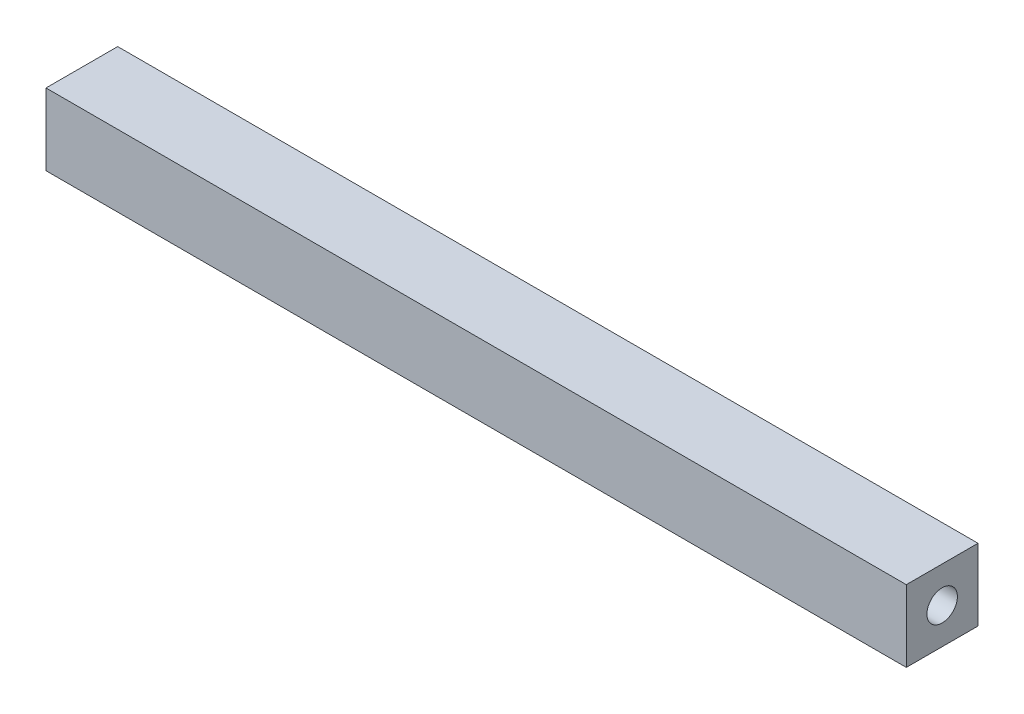
ISO-10303-21;
HEADER;
FILE_DESCRIPTION(('STEP AP214'),'2;1');
FILE_NAME('part.step','',(''),(''),'','','');
FILE_SCHEMA(('AUTOMOTIVE_DESIGN { 1 0 10303 214 1 1 1 1 }'));
ENDSEC;
DATA;
#1=APPLICATION_CONTEXT('core data for automotive mechanical design processes');
#2=APPLICATION_PROTOCOL_DEFINITION('international standard','automotive_design',2000,#1);
#3=PRODUCT_CONTEXT('',#1,'mechanical');
#4=PRODUCT('Part','Part','',(#3));
#5=PRODUCT_RELATED_PRODUCT_CATEGORY('part','',(#4));
#6=PRODUCT_DEFINITION_FORMATION('','',#4);
#7=PRODUCT_DEFINITION_CONTEXT('part definition',#1,'design');
#8=PRODUCT_DEFINITION('design','',#6,#7);
#9=PRODUCT_DEFINITION_SHAPE('','',#8);
#10=(LENGTH_UNIT() NAMED_UNIT(*) SI_UNIT(.MILLI.,.METRE.));
#11=(NAMED_UNIT(*) PLANE_ANGLE_UNIT() SI_UNIT($,.RADIAN.));
#12=(NAMED_UNIT(*) SI_UNIT($,.STERADIAN.) SOLID_ANGLE_UNIT());
#13=UNCERTAINTY_MEASURE_WITH_UNIT(LENGTH_MEASURE(1.E-05),#10,'distance_accuracy_value','');
#14=(GEOMETRIC_REPRESENTATION_CONTEXT(3) GLOBAL_UNCERTAINTY_ASSIGNED_CONTEXT((#13)) GLOBAL_UNIT_ASSIGNED_CONTEXT((#10,
#11,#12)) REPRESENTATION_CONTEXT('',''));
#15=CARTESIAN_POINT('',(0.,0.,0.));
#16=DIRECTION('',(0.,0.,1.));
#17=DIRECTION('',(1.,0.,0.));
#18=AXIS2_PLACEMENT_3D('',#15,#16,#17);
#19=CARTESIAN_POINT('',(24.,-2.,2.));
#20=DIRECTION('',(0.,0.,-1.));
#21=DIRECTION('',(-1.,0.,0.));
#22=AXIS2_PLACEMENT_3D('',#19,#20,#21);
#23=PLANE('',#22);
#24=DIRECTION('',(0.,-1.,0.));
#25=VECTOR('',#24,1.);
#26=CARTESIAN_POINT('',(-24.,-2.,2.));
#27=LINE('',#26,#25);
#28=CARTESIAN_POINT('',(-24.,2.,2.));
#29=VERTEX_POINT('',#28);
#30=CARTESIAN_POINT('',(-24.,-2.,2.));
#31=VERTEX_POINT('',#30);
#32=EDGE_CURVE('E95',#29,#31,#27,.T.);
#33=ORIENTED_EDGE('',*,*,#32,.T.);
#34=DIRECTION('',(-1.,0.,0.));
#35=VECTOR('',#34,1.);
#36=CARTESIAN_POINT('',(24.,-2.,2.));
#37=LINE('',#36,#35);
#38=CARTESIAN_POINT('',(24.,-2.,2.));
#39=VERTEX_POINT('',#38);
#40=EDGE_CURVE('E11',#39,#31,#37,.T.);
#41=ORIENTED_EDGE('',*,*,#40,.F.);
#42=DIRECTION('',(0.,-1.,0.));
#43=VECTOR('',#42,1.);
#44=CARTESIAN_POINT('',(24.,-2.,2.));
#45=LINE('',#44,#43);
#46=CARTESIAN_POINT('',(24.,2.,2.));
#47=VERTEX_POINT('',#46);
#48=EDGE_CURVE('E83',#47,#39,#45,.T.);
#49=ORIENTED_EDGE('',*,*,#48,.F.);
#50=DIRECTION('',(-1.,0.,0.));
#51=VECTOR('',#50,1.);
#52=CARTESIAN_POINT('',(24.,2.,2.));
#53=LINE('',#52,#51);
#54=EDGE_CURVE('E91',#47,#29,#53,.T.);
#55=ORIENTED_EDGE('',*,*,#54,.T.);
#56=EDGE_LOOP('',(#33,#41,#49,#55));
#57=FACE_BOUND('',#56,.T.);
#58=ADVANCED_FACE('F32',(#57),#23,.F.);
#59=CARTESIAN_POINT('',(24.,-2.,-2.));
#60=DIRECTION('',(0.,1.,0.));
#61=DIRECTION('',(0.,0.,1.));
#62=AXIS2_PLACEMENT_3D('',#59,#60,#61);
#63=PLANE('',#62);
#64=DIRECTION('',(0.,0.,-1.));
#65=VECTOR('',#64,1.);
#66=CARTESIAN_POINT('',(-24.,-2.,-2.));
#67=LINE('',#66,#65);
#68=CARTESIAN_POINT('',(-24.,-2.,-2.));
#69=VERTEX_POINT('',#68);
#70=EDGE_CURVE('E87',#31,#69,#67,.T.);
#71=ORIENTED_EDGE('',*,*,#70,.T.);
#72=DIRECTION('',(-1.,0.,0.));
#73=VECTOR('',#72,1.);
#74=CARTESIAN_POINT('',(24.,-2.,-2.));
#75=LINE('',#74,#73);
#76=CARTESIAN_POINT('',(24.,-2.,-2.));
#77=VERTEX_POINT('',#76);
#78=EDGE_CURVE('E40',#77,#69,#75,.T.);
#79=ORIENTED_EDGE('',*,*,#78,.F.);
#80=DIRECTION('',(0.,0.,-1.));
#81=VECTOR('',#80,1.);
#82=CARTESIAN_POINT('',(24.,-2.,-2.));
#83=LINE('',#82,#81);
#84=EDGE_CURVE('E78',#39,#77,#83,.T.);
#85=ORIENTED_EDGE('',*,*,#84,.F.);
#86=ORIENTED_EDGE('',*,*,#40,.T.);
#87=EDGE_LOOP('',(#71,#79,#85,#86));
#88=FACE_BOUND('',#87,.T.);
#89=ADVANCED_FACE('F86',(#88),#63,.F.);
#90=CARTESIAN_POINT('',(24.,-2.,-2.));
#91=DIRECTION('',(0.,0.,1.));
#92=DIRECTION('',(1.,0.,0.));
#93=AXIS2_PLACEMENT_3D('',#90,#91,#92);
#94=PLANE('',#93);
#95=DIRECTION('',(0.,1.,0.));
#96=VECTOR('',#95,1.);
#97=CARTESIAN_POINT('',(-24.,-2.,-2.));
#98=LINE('',#97,#96);
#99=CARTESIAN_POINT('',(-24.,2.,-2.));
#100=VERTEX_POINT('',#99);
#101=EDGE_CURVE('E65',#69,#100,#98,.T.);
#102=ORIENTED_EDGE('',*,*,#101,.T.);
#103=DIRECTION('',(-1.,0.,0.));
#104=VECTOR('',#103,1.);
#105=CARTESIAN_POINT('',(24.,2.,-2.));
#106=LINE('',#105,#104);
#107=CARTESIAN_POINT('',(24.,2.,-2.));
#108=VERTEX_POINT('',#107);
#109=EDGE_CURVE('E88',#108,#100,#106,.T.);
#110=ORIENTED_EDGE('',*,*,#109,.F.);
#111=DIRECTION('',(0.,1.,0.));
#112=VECTOR('',#111,1.);
#113=CARTESIAN_POINT('',(24.,-2.,-2.));
#114=LINE('',#113,#112);
#115=EDGE_CURVE('E81',#77,#108,#114,.T.);
#116=ORIENTED_EDGE('',*,*,#115,.F.);
#117=ORIENTED_EDGE('',*,*,#78,.T.);
#118=EDGE_LOOP('',(#102,#110,#116,#117));
#119=FACE_BOUND('',#118,.T.);
#120=ADVANCED_FACE('F89',(#119),#94,.F.);
#121=CARTESIAN_POINT('',(24.,2.,-2.));
#122=DIRECTION('',(0.,-1.,0.));
#123=DIRECTION('',(0.,0.,-1.));
#124=AXIS2_PLACEMENT_3D('',#121,#122,#123);
#125=PLANE('',#124);
#126=DIRECTION('',(0.,0.,1.));
#127=VECTOR('',#126,1.);
#128=CARTESIAN_POINT('',(-24.,2.,-2.));
#129=LINE('',#128,#127);
#130=EDGE_CURVE('E71',#100,#29,#129,.T.);
#131=ORIENTED_EDGE('',*,*,#130,.T.);
#132=ORIENTED_EDGE('',*,*,#54,.F.);
#133=DIRECTION('',(0.,0.,1.));
#134=VECTOR('',#133,1.);
#135=CARTESIAN_POINT('',(24.,2.,-2.));
#136=LINE('',#135,#134);
#137=EDGE_CURVE('E48',#108,#47,#136,.T.);
#138=ORIENTED_EDGE('',*,*,#137,.F.);
#139=ORIENTED_EDGE('',*,*,#109,.T.);
#140=EDGE_LOOP('',(#131,#132,#138,#139));
#141=FACE_BOUND('',#140,.T.);
#142=ADVANCED_FACE('F103',(#141),#125,.F.);
#143=CARTESIAN_POINT('',(24.,0.,0.));
#144=DIRECTION('',(1.,0.,0.));
#145=DIRECTION('',(0.,0.,-1.));
#146=AXIS2_PLACEMENT_3D('',#143,#144,#145);
#147=PLANE('',#146);
#148=CARTESIAN_POINT('',(24.,0.,0.));
#149=DIRECTION('',(1.,0.,0.));
#150=DIRECTION('',(0.,0.,-1.));
#151=AXIS2_PLACEMENT_3D('',#148,#149,#150);
#152=CIRCLE('',#151,0.85);
#153=CARTESIAN_POINT('',(24.,0.,-0.85));
#154=VERTEX_POINT('',#153);
#155=EDGE_CURVE('E98',#154,#154,#152,.T.);
#156=ORIENTED_EDGE('',*,*,#155,.F.);
#157=EDGE_LOOP('',(#156));
#158=FACE_BOUND('',#157,.T.);
#159=ORIENTED_EDGE('',*,*,#48,.T.);
#160=ORIENTED_EDGE('',*,*,#84,.T.);
#161=ORIENTED_EDGE('',*,*,#115,.T.);
#162=ORIENTED_EDGE('',*,*,#137,.T.);
#163=EDGE_LOOP('',(#159,#160,#161,#162));
#164=FACE_BOUND('',#163,.T.);
#165=ADVANCED_FACE('F79',(#158,#164),#147,.T.);
#166=CARTESIAN_POINT('',(-24.,0.,0.));
#167=DIRECTION('',(1.,0.,0.));
#168=DIRECTION('',(0.,0.,-1.));
#169=AXIS2_PLACEMENT_3D('',#166,#167,#168);
#170=PLANE('',#169);
#171=CARTESIAN_POINT('',(-24.,0.,0.));
#172=DIRECTION('',(1.,0.,0.));
#173=DIRECTION('',(0.,0.,-1.));
#174=AXIS2_PLACEMENT_3D('',#171,#172,#173);
#175=CIRCLE('',#174,0.85);
#176=CARTESIAN_POINT('',(-24.,0.,-0.85));
#177=VERTEX_POINT('',#176);
#178=EDGE_CURVE('E111',#177,#177,#175,.T.);
#179=ORIENTED_EDGE('',*,*,#178,.T.);
#180=EDGE_LOOP('',(#179));
#181=FACE_BOUND('',#180,.T.);
#182=ORIENTED_EDGE('',*,*,#32,.F.);
#183=ORIENTED_EDGE('',*,*,#130,.F.);
#184=ORIENTED_EDGE('',*,*,#101,.F.);
#185=ORIENTED_EDGE('',*,*,#70,.F.);
#186=EDGE_LOOP('',(#182,#183,#184,#185));
#187=FACE_BOUND('',#186,.T.);
#188=ADVANCED_FACE('F106',(#181,#187),#170,.F.);
#189=CARTESIAN_POINT('',(-24.,0.,0.));
#190=DIRECTION('',(1.,0.,0.));
#191=DIRECTION('',(0.,0.,-1.));
#192=AXIS2_PLACEMENT_3D('',#189,#190,#191);
#193=CYLINDRICAL_SURFACE('',#192,0.85);
#194=ORIENTED_EDGE('',*,*,#155,.T.);
#195=EDGE_LOOP('',(#194));
#196=FACE_BOUND('',#195,.T.);
#197=ORIENTED_EDGE('',*,*,#178,.F.);
#198=EDGE_LOOP('',(#197));
#199=FACE_BOUND('',#198,.T.);
#200=ADVANCED_FACE('F116',(#196,#199),#193,.F.);
#201=CLOSED_SHELL('',(#58,#89,#120,#142,#165,#188,#200));
#202=MANIFOLD_SOLID_BREP('B2',#201);
#203=ADVANCED_BREP_SHAPE_REPRESENTATION('',(#18,#202),#14);
#204=SHAPE_DEFINITION_REPRESENTATION(#9,#203);
ENDSEC;
END-ISO-10303-21;
